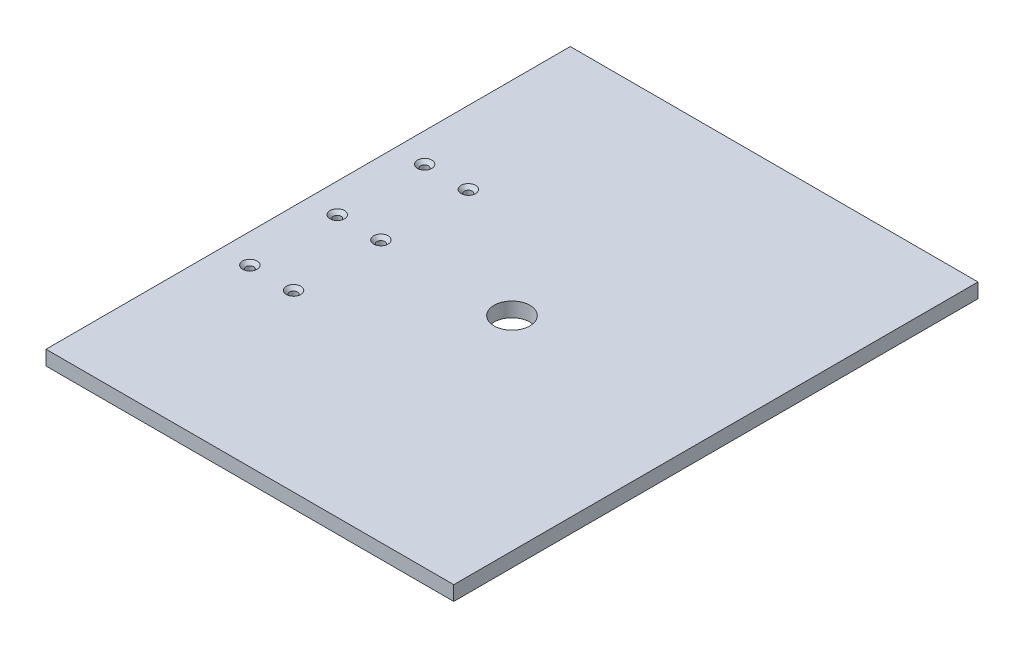
ISO-10303-21;
HEADER;
FILE_DESCRIPTION(('STEP AP214'),'2;1');
FILE_NAME('part.step','',(''),(''),'','','');
FILE_SCHEMA(('AUTOMOTIVE_DESIGN { 1 0 10303 214 1 1 1 1 }'));
ENDSEC;
DATA;
#1=APPLICATION_CONTEXT('core data for automotive mechanical design processes');
#2=APPLICATION_PROTOCOL_DEFINITION('international standard','automotive_design',2000,#1);
#3=PRODUCT_CONTEXT('',#1,'mechanical');
#4=PRODUCT('Part','Part','',(#3));
#5=PRODUCT_RELATED_PRODUCT_CATEGORY('part','',(#4));
#6=PRODUCT_DEFINITION_FORMATION('','',#4);
#7=PRODUCT_DEFINITION_CONTEXT('part definition',#1,'design');
#8=PRODUCT_DEFINITION('design','',#6,#7);
#9=PRODUCT_DEFINITION_SHAPE('','',#8);
#10=(LENGTH_UNIT() NAMED_UNIT(*) SI_UNIT(.MILLI.,.METRE.));
#11=(NAMED_UNIT(*) PLANE_ANGLE_UNIT() SI_UNIT($,.RADIAN.));
#12=(NAMED_UNIT(*) SI_UNIT($,.STERADIAN.) SOLID_ANGLE_UNIT());
#13=UNCERTAINTY_MEASURE_WITH_UNIT(LENGTH_MEASURE(1.E-05),#10,'distance_accuracy_value','');
#14=(GEOMETRIC_REPRESENTATION_CONTEXT(3) GLOBAL_UNCERTAINTY_ASSIGNED_CONTEXT((#13)) GLOBAL_UNIT_ASSIGNED_CONTEXT((#10,
#11,#12)) REPRESENTATION_CONTEXT('',''));
#15=CARTESIAN_POINT('',(0.,0.,0.));
#16=DIRECTION('',(0.,0.,1.));
#17=DIRECTION('',(1.,0.,0.));
#18=AXIS2_PLACEMENT_3D('',#15,#16,#17);
#19=CARTESIAN_POINT('',(177.8,6.35,114.3));
#20=DIRECTION('',(-1.,0.,0.));
#21=DIRECTION('',(0.,0.,1.));
#22=AXIS2_PLACEMENT_3D('',#19,#20,#21);
#23=PLANE('',#22);
#24=DIRECTION('',(0.,0.,-1.));
#25=VECTOR('',#24,1.);
#26=CARTESIAN_POINT('',(177.8,0.,114.3));
#27=LINE('',#26,#25);
#28=CARTESIAN_POINT('',(177.8,0.,114.3));
#29=VERTEX_POINT('',#28);
#30=CARTESIAN_POINT('',(177.8,0.,-114.3));
#31=VERTEX_POINT('',#30);
#32=EDGE_CURVE('E95',#29,#31,#27,.T.);
#33=ORIENTED_EDGE('',*,*,#32,.T.);
#34=DIRECTION('',(0.,-1.,0.));
#35=VECTOR('',#34,1.);
#36=CARTESIAN_POINT('',(177.8,6.35,-114.3));
#37=LINE('',#36,#35);
#38=CARTESIAN_POINT('',(177.8,6.35,-114.3));
#39=VERTEX_POINT('',#38);
#40=EDGE_CURVE('E11',#39,#31,#37,.T.);
#41=ORIENTED_EDGE('',*,*,#40,.F.);
#42=DIRECTION('',(0.,0.,-1.));
#43=VECTOR('',#42,1.);
#44=CARTESIAN_POINT('',(177.8,6.35,114.3));
#45=LINE('',#44,#43);
#46=CARTESIAN_POINT('',(177.8,6.35,114.3));
#47=VERTEX_POINT('',#46);
#48=EDGE_CURVE('E83',#47,#39,#45,.T.);
#49=ORIENTED_EDGE('',*,*,#48,.F.);
#50=DIRECTION('',(0.,-1.,0.));
#51=VECTOR('',#50,1.);
#52=CARTESIAN_POINT('',(177.8,6.35,114.3));
#53=LINE('',#52,#51);
#54=EDGE_CURVE('E91',#47,#29,#53,.T.);
#55=ORIENTED_EDGE('',*,*,#54,.T.);
#56=EDGE_LOOP('',(#33,#41,#49,#55));
#57=FACE_BOUND('',#56,.T.);
#58=ADVANCED_FACE('F32',(#57),#23,.F.);
#59=CARTESIAN_POINT('',(0.,6.35,-114.3));
#60=DIRECTION('',(0.,0.,1.));
#61=DIRECTION('',(1.,0.,0.));
#62=AXIS2_PLACEMENT_3D('',#59,#60,#61);
#63=PLANE('',#62);
#64=DIRECTION('',(-1.,0.,0.));
#65=VECTOR('',#64,1.);
#66=CARTESIAN_POINT('',(0.,0.,-114.3));
#67=LINE('',#66,#65);
#68=CARTESIAN_POINT('',(0.,0.,-114.3));
#69=VERTEX_POINT('',#68);
#70=EDGE_CURVE('E87',#31,#69,#67,.T.);
#71=ORIENTED_EDGE('',*,*,#70,.T.);
#72=DIRECTION('',(0.,-1.,0.));
#73=VECTOR('',#72,1.);
#74=CARTESIAN_POINT('',(0.,6.35,-114.3));
#75=LINE('',#74,#73);
#76=CARTESIAN_POINT('',(0.,6.35,-114.3));
#77=VERTEX_POINT('',#76);
#78=EDGE_CURVE('E40',#77,#69,#75,.T.);
#79=ORIENTED_EDGE('',*,*,#78,.F.);
#80=DIRECTION('',(-1.,0.,0.));
#81=VECTOR('',#80,1.);
#82=CARTESIAN_POINT('',(0.,6.35,-114.3));
#83=LINE('',#82,#81);
#84=EDGE_CURVE('E78',#39,#77,#83,.T.);
#85=ORIENTED_EDGE('',*,*,#84,.F.);
#86=ORIENTED_EDGE('',*,*,#40,.T.);
#87=EDGE_LOOP('',(#71,#79,#85,#86));
#88=FACE_BOUND('',#87,.T.);
#89=ADVANCED_FACE('F86',(#88),#63,.F.);
#90=CARTESIAN_POINT('',(0.,6.35,114.3));
#91=DIRECTION('',(1.,0.,0.));
#92=DIRECTION('',(0.,0.,-1.));
#93=AXIS2_PLACEMENT_3D('',#90,#91,#92);
#94=PLANE('',#93);
#95=DIRECTION('',(0.,0.,1.));
#96=VECTOR('',#95,1.);
#97=CARTESIAN_POINT('',(0.,0.,114.3));
#98=LINE('',#97,#96);
#99=CARTESIAN_POINT('',(0.,0.,114.3));
#100=VERTEX_POINT('',#99);
#101=EDGE_CURVE('E65',#69,#100,#98,.T.);
#102=ORIENTED_EDGE('',*,*,#101,.T.);
#103=DIRECTION('',(0.,-1.,0.));
#104=VECTOR('',#103,1.);
#105=CARTESIAN_POINT('',(0.,6.35,114.3));
#106=LINE('',#105,#104);
#107=CARTESIAN_POINT('',(0.,6.35,114.3));
#108=VERTEX_POINT('',#107);
#109=EDGE_CURVE('E88',#108,#100,#106,.T.);
#110=ORIENTED_EDGE('',*,*,#109,.F.);
#111=DIRECTION('',(0.,0.,1.));
#112=VECTOR('',#111,1.);
#113=CARTESIAN_POINT('',(0.,6.35,114.3));
#114=LINE('',#113,#112);
#115=EDGE_CURVE('E81',#77,#108,#114,.T.);
#116=ORIENTED_EDGE('',*,*,#115,.F.);
#117=ORIENTED_EDGE('',*,*,#78,.T.);
#118=EDGE_LOOP('',(#102,#110,#116,#117));
#119=FACE_BOUND('',#118,.T.);
#120=ADVANCED_FACE('F89',(#119),#94,.F.);
#121=CARTESIAN_POINT('',(0.,6.35,114.3));
#122=DIRECTION('',(0.,0.,-1.));
#123=DIRECTION('',(-1.,0.,0.));
#124=AXIS2_PLACEMENT_3D('',#121,#122,#123);
#125=PLANE('',#124);
#126=DIRECTION('',(1.,0.,0.));
#127=VECTOR('',#126,1.);
#128=CARTESIAN_POINT('',(0.,0.,114.3));
#129=LINE('',#128,#127);
#130=EDGE_CURVE('E71',#100,#29,#129,.T.);
#131=ORIENTED_EDGE('',*,*,#130,.T.);
#132=ORIENTED_EDGE('',*,*,#54,.F.);
#133=DIRECTION('',(1.,0.,0.));
#134=VECTOR('',#133,1.);
#135=CARTESIAN_POINT('',(0.,6.35,114.3));
#136=LINE('',#135,#134);
#137=EDGE_CURVE('E48',#108,#47,#136,.T.);
#138=ORIENTED_EDGE('',*,*,#137,.F.);
#139=ORIENTED_EDGE('',*,*,#109,.T.);
#140=EDGE_LOOP('',(#131,#132,#138,#139));
#141=FACE_BOUND('',#140,.T.);
#142=ADVANCED_FACE('F103',(#141),#125,.F.);
#143=CARTESIAN_POINT('',(0.,6.35,0.));
#144=DIRECTION('',(0.,-1.,0.));
#145=DIRECTION('',(0.,0.,-1.));
#146=AXIS2_PLACEMENT_3D('',#143,#144,#145);
#147=PLANE('',#146);
#148=CARTESIAN_POINT('',(12.7,6.35,0.));
#149=DIRECTION('',(0.,1.,0.));
#150=DIRECTION('',(0.,0.,1.));
#151=AXIS2_PLACEMENT_3D('',#148,#149,#150);
#152=CIRCLE('',#151,3.15);
#153=CARTESIAN_POINT('',(12.7,6.35,3.15));
#154=VERTEX_POINT('',#153);
#155=EDGE_CURVE('E165',#154,#154,#152,.T.);
#156=ORIENTED_EDGE('',*,*,#155,.F.);
#157=EDGE_LOOP('',(#156));
#158=FACE_BOUND('',#157,.T.);
#159=CARTESIAN_POINT('',(12.7,6.35,38.1));
#160=DIRECTION('',(0.,1.,0.));
#161=DIRECTION('',(0.,0.,1.));
#162=AXIS2_PLACEMENT_3D('',#159,#160,#161);
#163=CIRCLE('',#162,3.15);
#164=CARTESIAN_POINT('',(12.7,6.35,41.25));
#165=VERTEX_POINT('',#164);
#166=EDGE_CURVE('E156',#165,#165,#163,.T.);
#167=ORIENTED_EDGE('',*,*,#166,.F.);
#168=EDGE_LOOP('',(#167));
#169=FACE_BOUND('',#168,.T.);
#170=CARTESIAN_POINT('',(31.75,6.35,38.1));
#171=DIRECTION('',(0.,1.,0.));
#172=DIRECTION('',(0.,0.,1.));
#173=AXIS2_PLACEMENT_3D('',#170,#171,#172);
#174=CIRCLE('',#173,3.15);
#175=CARTESIAN_POINT('',(31.75,6.35,41.25));
#176=VERTEX_POINT('',#175);
#177=EDGE_CURVE('E147',#176,#176,#174,.T.);
#178=ORIENTED_EDGE('',*,*,#177,.F.);
#179=EDGE_LOOP('',(#178));
#180=FACE_BOUND('',#179,.T.);
#181=CARTESIAN_POINT('',(12.7,6.35,-38.1));
#182=DIRECTION('',(0.,1.,0.));
#183=DIRECTION('',(0.,0.,1.));
#184=AXIS2_PLACEMENT_3D('',#181,#182,#183);
#185=CIRCLE('',#184,3.15);
#186=CARTESIAN_POINT('',(12.7,6.35,-34.95));
#187=VERTEX_POINT('',#186);
#188=EDGE_CURVE('E138',#187,#187,#185,.T.);
#189=ORIENTED_EDGE('',*,*,#188,.F.);
#190=EDGE_LOOP('',(#189));
#191=FACE_BOUND('',#190,.T.);
#192=CARTESIAN_POINT('',(31.75,6.35,-38.1));
#193=DIRECTION('',(0.,1.,0.));
#194=DIRECTION('',(0.,0.,1.));
#195=AXIS2_PLACEMENT_3D('',#192,#193,#194);
#196=CIRCLE('',#195,3.15);
#197=CARTESIAN_POINT('',(31.75,6.35,-34.95));
#198=VERTEX_POINT('',#197);
#199=EDGE_CURVE('E129',#198,#198,#196,.T.);
#200=ORIENTED_EDGE('',*,*,#199,.F.);
#201=EDGE_LOOP('',(#200));
#202=FACE_BOUND('',#201,.T.);
#203=CARTESIAN_POINT('',(31.75,6.35,0.));
#204=DIRECTION('',(0.,1.,0.));
#205=DIRECTION('',(0.,0.,1.));
#206=AXIS2_PLACEMENT_3D('',#203,#204,#205);
#207=CIRCLE('',#206,3.15);
#208=CARTESIAN_POINT('',(31.75,6.35,3.15));
#209=VERTEX_POINT('',#208);
#210=EDGE_CURVE('E120',#209,#209,#207,.T.);
#211=ORIENTED_EDGE('',*,*,#210,.F.);
#212=EDGE_LOOP('',(#211));
#213=FACE_BOUND('',#212,.T.);
#214=CARTESIAN_POINT('',(88.9,6.35,0.));
#215=DIRECTION('',(0.,1.,0.));
#216=DIRECTION('',(0.,0.,1.));
#217=AXIS2_PLACEMENT_3D('',#214,#215,#216);
#218=CIRCLE('',#217,7.81000000100001);
#219=CARTESIAN_POINT('',(88.9,6.35,7.81000000100001));
#220=VERTEX_POINT('',#219);
#221=EDGE_CURVE('E98',#220,#220,#218,.T.);
#222=ORIENTED_EDGE('',*,*,#221,.F.);
#223=EDGE_LOOP('',(#222));
#224=FACE_BOUND('',#223,.T.);
#225=ORIENTED_EDGE('',*,*,#48,.T.);
#226=ORIENTED_EDGE('',*,*,#84,.T.);
#227=ORIENTED_EDGE('',*,*,#115,.T.);
#228=ORIENTED_EDGE('',*,*,#137,.T.);
#229=EDGE_LOOP('',(#225,#226,#227,#228));
#230=FACE_BOUND('',#229,.T.);
#231=ADVANCED_FACE('F79',(#158,#169,#180,#191,#202,#213,#224,#230),#147,.F.);
#232=CARTESIAN_POINT('',(0.,0.,0.));
#233=DIRECTION('',(0.,-1.,0.));
#234=DIRECTION('',(0.,0.,-1.));
#235=AXIS2_PLACEMENT_3D('',#232,#233,#234);
#236=PLANE('',#235);
#237=CARTESIAN_POINT('',(12.7,0.,0.));
#238=DIRECTION('',(0.,1.,0.));
#239=DIRECTION('',(0.,0.,1.));
#240=AXIS2_PLACEMENT_3D('',#237,#238,#239);
#241=CIRCLE('',#240,1.7);
#242=CARTESIAN_POINT('',(12.7,0.,1.7));
#243=VERTEX_POINT('',#242);
#244=EDGE_CURVE('E159',#243,#243,#241,.T.);
#245=ORIENTED_EDGE('',*,*,#244,.T.);
#246=EDGE_LOOP('',(#245));
#247=FACE_BOUND('',#246,.T.);
#248=CARTESIAN_POINT('',(12.7,0.,38.1));
#249=DIRECTION('',(0.,1.,0.));
#250=DIRECTION('',(0.,0.,1.));
#251=AXIS2_PLACEMENT_3D('',#248,#249,#250);
#252=CIRCLE('',#251,1.7);
#253=CARTESIAN_POINT('',(12.7,0.,39.8));
#254=VERTEX_POINT('',#253);
#255=EDGE_CURVE('E150',#254,#254,#252,.T.);
#256=ORIENTED_EDGE('',*,*,#255,.T.);
#257=EDGE_LOOP('',(#256));
#258=FACE_BOUND('',#257,.T.);
#259=CARTESIAN_POINT('',(31.75,0.,38.1));
#260=DIRECTION('',(0.,1.,0.));
#261=DIRECTION('',(0.,0.,1.));
#262=AXIS2_PLACEMENT_3D('',#259,#260,#261);
#263=CIRCLE('',#262,1.7);
#264=CARTESIAN_POINT('',(31.75,0.,39.8));
#265=VERTEX_POINT('',#264);
#266=EDGE_CURVE('E141',#265,#265,#263,.T.);
#267=ORIENTED_EDGE('',*,*,#266,.T.);
#268=EDGE_LOOP('',(#267));
#269=FACE_BOUND('',#268,.T.);
#270=CARTESIAN_POINT('',(12.7,0.,-38.1));
#271=DIRECTION('',(0.,1.,0.));
#272=DIRECTION('',(0.,0.,1.));
#273=AXIS2_PLACEMENT_3D('',#270,#271,#272);
#274=CIRCLE('',#273,1.7);
#275=CARTESIAN_POINT('',(12.7,0.,-36.4));
#276=VERTEX_POINT('',#275);
#277=EDGE_CURVE('E132',#276,#276,#274,.T.);
#278=ORIENTED_EDGE('',*,*,#277,.T.);
#279=EDGE_LOOP('',(#278));
#280=FACE_BOUND('',#279,.T.);
#281=CARTESIAN_POINT('',(31.75,0.,-38.1));
#282=DIRECTION('',(0.,1.,0.));
#283=DIRECTION('',(0.,0.,1.));
#284=AXIS2_PLACEMENT_3D('',#281,#282,#283);
#285=CIRCLE('',#284,1.7);
#286=CARTESIAN_POINT('',(31.75,0.,-36.4));
#287=VERTEX_POINT('',#286);
#288=EDGE_CURVE('E123',#287,#287,#285,.T.);
#289=ORIENTED_EDGE('',*,*,#288,.T.);
#290=EDGE_LOOP('',(#289));
#291=FACE_BOUND('',#290,.T.);
#292=CARTESIAN_POINT('',(31.75,0.,0.));
#293=DIRECTION('',(0.,1.,0.));
#294=DIRECTION('',(0.,0.,1.));
#295=AXIS2_PLACEMENT_3D('',#292,#293,#294);
#296=CIRCLE('',#295,1.7);
#297=CARTESIAN_POINT('',(31.75,0.,1.7));
#298=VERTEX_POINT('',#297);
#299=EDGE_CURVE('E112',#298,#298,#296,.T.);
#300=ORIENTED_EDGE('',*,*,#299,.T.);
#301=EDGE_LOOP('',(#300));
#302=FACE_BOUND('',#301,.T.);
#303=CARTESIAN_POINT('',(88.9,0.,0.));
#304=DIRECTION('',(0.,-1.,0.));
#305=DIRECTION('',(0.,0.,-1.));
#306=AXIS2_PLACEMENT_3D('',#303,#304,#305);
#307=CIRCLE('',#306,7.81000000100001);
#308=CARTESIAN_POINT('',(88.9,0.,-7.81000000100001));
#309=VERTEX_POINT('',#308);
#310=EDGE_CURVE('E109',#309,#309,#307,.F.);
#311=ORIENTED_EDGE('',*,*,#310,.T.);
#312=EDGE_LOOP('',(#311));
#313=FACE_BOUND('',#312,.T.);
#314=ORIENTED_EDGE('',*,*,#32,.F.);
#315=ORIENTED_EDGE('',*,*,#130,.F.);
#316=ORIENTED_EDGE('',*,*,#101,.F.);
#317=ORIENTED_EDGE('',*,*,#70,.F.);
#318=EDGE_LOOP('',(#314,#315,#316,#317));
#319=FACE_BOUND('',#318,.T.);
#320=ADVANCED_FACE('F106',(#247,#258,#269,#280,#291,#302,#313,#319),#236,.T.);
#321=CARTESIAN_POINT('',(88.9,-0.00100000000000013,0.));
#322=DIRECTION('',(0.,1.,0.));
#323=DIRECTION('',(0.,0.,1.));
#324=AXIS2_PLACEMENT_3D('',#321,#322,#323);
#325=CYLINDRICAL_SURFACE('',#324,7.81000000100001);
#326=ORIENTED_EDGE('',*,*,#310,.F.);
#327=EDGE_LOOP('',(#326));
#328=FACE_BOUND('',#327,.T.);
#329=ORIENTED_EDGE('',*,*,#221,.T.);
#330=EDGE_LOOP('',(#329));
#331=FACE_BOUND('',#330,.T.);
#332=ADVANCED_FACE('F186',(#328,#331),#325,.F.);
#333=CARTESIAN_POINT('',(31.75,6.35,0.));
#334=DIRECTION('',(0.,1.,0.));
#335=DIRECTION('',(0.,0.,1.));
#336=AXIS2_PLACEMENT_3D('',#333,#334,#335);
#337=CYLINDRICAL_SURFACE('',#336,1.7);
#338=ORIENTED_EDGE('',*,*,#299,.F.);
#339=EDGE_LOOP('',(#338));
#340=FACE_BOUND('',#339,.T.);
#341=CARTESIAN_POINT('',(31.75,4.9,0.));
#342=DIRECTION('',(0.,1.,0.));
#343=DIRECTION('',(0.,0.,1.));
#344=AXIS2_PLACEMENT_3D('',#341,#342,#343);
#345=CIRCLE('',#344,1.7);
#346=CARTESIAN_POINT('',(31.75,4.9,1.7));
#347=VERTEX_POINT('',#346);
#348=EDGE_CURVE('E117',#347,#347,#345,.T.);
#349=ORIENTED_EDGE('',*,*,#348,.T.);
#350=EDGE_LOOP('',(#349));
#351=FACE_BOUND('',#350,.T.);
#352=ADVANCED_FACE('F188',(#340,#351),#337,.F.);
#353=CARTESIAN_POINT('',(31.75,6.35,0.));
#354=DIRECTION('',(0.,1.,0.));
#355=DIRECTION('',(0.,0.,1.));
#356=AXIS2_PLACEMENT_3D('',#353,#354,#355);
#357=CONICAL_SURFACE('',#356,3.15,0.785398163397448);
#358=ORIENTED_EDGE('',*,*,#348,.F.);
#359=EDGE_LOOP('',(#358));
#360=FACE_BOUND('',#359,.T.);
#361=ORIENTED_EDGE('',*,*,#210,.T.);
#362=EDGE_LOOP('',(#361));
#363=FACE_BOUND('',#362,.T.);
#364=ADVANCED_FACE('F195',(#360,#363),#357,.F.);
#365=CARTESIAN_POINT('',(31.75,6.35,-38.1));
#366=DIRECTION('',(0.,1.,0.));
#367=DIRECTION('',(0.,0.,1.));
#368=AXIS2_PLACEMENT_3D('',#365,#366,#367);
#369=CYLINDRICAL_SURFACE('',#368,1.7);
#370=ORIENTED_EDGE('',*,*,#288,.F.);
#371=EDGE_LOOP('',(#370));
#372=FACE_BOUND('',#371,.T.);
#373=CARTESIAN_POINT('',(31.75,4.9,-38.1));
#374=DIRECTION('',(0.,1.,0.));
#375=DIRECTION('',(0.,0.,1.));
#376=AXIS2_PLACEMENT_3D('',#373,#374,#375);
#377=CIRCLE('',#376,1.7);
#378=CARTESIAN_POINT('',(31.75,4.9,-36.4));
#379=VERTEX_POINT('',#378);
#380=EDGE_CURVE('E126',#379,#379,#377,.T.);
#381=ORIENTED_EDGE('',*,*,#380,.T.);
#382=EDGE_LOOP('',(#381));
#383=FACE_BOUND('',#382,.T.);
#384=ADVANCED_FACE('F239',(#372,#383),#369,.F.);
#385=CARTESIAN_POINT('',(31.75,6.35,-38.1));
#386=DIRECTION('',(0.,1.,0.));
#387=DIRECTION('',(0.,0.,1.));
#388=AXIS2_PLACEMENT_3D('',#385,#386,#387);
#389=CONICAL_SURFACE('',#388,3.15,0.785398163397448);
#390=ORIENTED_EDGE('',*,*,#380,.F.);
#391=EDGE_LOOP('',(#390));
#392=FACE_BOUND('',#391,.T.);
#393=ORIENTED_EDGE('',*,*,#199,.T.);
#394=EDGE_LOOP('',(#393));
#395=FACE_BOUND('',#394,.T.);
#396=ADVANCED_FACE('F249',(#392,#395),#389,.F.);
#397=CARTESIAN_POINT('',(12.7,6.35,-38.1));
#398=DIRECTION('',(0.,1.,0.));
#399=DIRECTION('',(0.,0.,1.));
#400=AXIS2_PLACEMENT_3D('',#397,#398,#399);
#401=CYLINDRICAL_SURFACE('',#400,1.7);
#402=ORIENTED_EDGE('',*,*,#277,.F.);
#403=EDGE_LOOP('',(#402));
#404=FACE_BOUND('',#403,.T.);
#405=CARTESIAN_POINT('',(12.7,4.9,-38.1));
#406=DIRECTION('',(0.,1.,0.));
#407=DIRECTION('',(0.,0.,1.));
#408=AXIS2_PLACEMENT_3D('',#405,#406,#407);
#409=CIRCLE('',#408,1.7);
#410=CARTESIAN_POINT('',(12.7,4.9,-36.4));
#411=VERTEX_POINT('',#410);
#412=EDGE_CURVE('E135',#411,#411,#409,.T.);
#413=ORIENTED_EDGE('',*,*,#412,.T.);
#414=EDGE_LOOP('',(#413));
#415=FACE_BOUND('',#414,.T.);
#416=ADVANCED_FACE('F259',(#404,#415),#401,.F.);
#417=CARTESIAN_POINT('',(12.7,6.35,-38.1));
#418=DIRECTION('',(0.,1.,0.));
#419=DIRECTION('',(0.,0.,1.));
#420=AXIS2_PLACEMENT_3D('',#417,#418,#419);
#421=CONICAL_SURFACE('',#420,3.15,0.78539816339745);
#422=ORIENTED_EDGE('',*,*,#412,.F.);
#423=EDGE_LOOP('',(#422));
#424=FACE_BOUND('',#423,.T.);
#425=ORIENTED_EDGE('',*,*,#188,.T.);
#426=EDGE_LOOP('',(#425));
#427=FACE_BOUND('',#426,.T.);
#428=ADVANCED_FACE('F269',(#424,#427),#421,.F.);
#429=CARTESIAN_POINT('',(31.75,6.35,38.1));
#430=DIRECTION('',(0.,1.,0.));
#431=DIRECTION('',(0.,0.,1.));
#432=AXIS2_PLACEMENT_3D('',#429,#430,#431);
#433=CYLINDRICAL_SURFACE('',#432,1.7);
#434=ORIENTED_EDGE('',*,*,#266,.F.);
#435=EDGE_LOOP('',(#434));
#436=FACE_BOUND('',#435,.T.);
#437=CARTESIAN_POINT('',(31.75,4.9,38.1));
#438=DIRECTION('',(0.,1.,0.));
#439=DIRECTION('',(0.,0.,1.));
#440=AXIS2_PLACEMENT_3D('',#437,#438,#439);
#441=CIRCLE('',#440,1.7);
#442=CARTESIAN_POINT('',(31.75,4.9,39.8));
#443=VERTEX_POINT('',#442);
#444=EDGE_CURVE('E144',#443,#443,#441,.T.);
#445=ORIENTED_EDGE('',*,*,#444,.T.);
#446=EDGE_LOOP('',(#445));
#447=FACE_BOUND('',#446,.T.);
#448=ADVANCED_FACE('F279',(#436,#447),#433,.F.);
#449=CARTESIAN_POINT('',(31.75,6.35,38.1));
#450=DIRECTION('',(0.,1.,0.));
#451=DIRECTION('',(0.,0.,1.));
#452=AXIS2_PLACEMENT_3D('',#449,#450,#451);
#453=CONICAL_SURFACE('',#452,3.15,0.785398163397448);
#454=ORIENTED_EDGE('',*,*,#444,.F.);
#455=EDGE_LOOP('',(#454));
#456=FACE_BOUND('',#455,.T.);
#457=ORIENTED_EDGE('',*,*,#177,.T.);
#458=EDGE_LOOP('',(#457));
#459=FACE_BOUND('',#458,.T.);
#460=ADVANCED_FACE('F289',(#456,#459),#453,.F.);
#461=CARTESIAN_POINT('',(12.7,6.35,38.1));
#462=DIRECTION('',(0.,1.,0.));
#463=DIRECTION('',(0.,0.,1.));
#464=AXIS2_PLACEMENT_3D('',#461,#462,#463);
#465=CYLINDRICAL_SURFACE('',#464,1.7);
#466=ORIENTED_EDGE('',*,*,#255,.F.);
#467=EDGE_LOOP('',(#466));
#468=FACE_BOUND('',#467,.T.);
#469=CARTESIAN_POINT('',(12.7,4.9,38.1));
#470=DIRECTION('',(0.,1.,0.));
#471=DIRECTION('',(0.,0.,1.));
#472=AXIS2_PLACEMENT_3D('',#469,#470,#471);
#473=CIRCLE('',#472,1.7);
#474=CARTESIAN_POINT('',(12.7,4.9,39.8));
#475=VERTEX_POINT('',#474);
#476=EDGE_CURVE('E153',#475,#475,#473,.T.);
#477=ORIENTED_EDGE('',*,*,#476,.T.);
#478=EDGE_LOOP('',(#477));
#479=FACE_BOUND('',#478,.T.);
#480=ADVANCED_FACE('F299',(#468,#479),#465,.F.);
#481=CARTESIAN_POINT('',(12.7,6.35,38.1));
#482=DIRECTION('',(0.,1.,0.));
#483=DIRECTION('',(0.,0.,1.));
#484=AXIS2_PLACEMENT_3D('',#481,#482,#483);
#485=CONICAL_SURFACE('',#484,3.15,0.785398163397449);
#486=ORIENTED_EDGE('',*,*,#476,.F.);
#487=EDGE_LOOP('',(#486));
#488=FACE_BOUND('',#487,.T.);
#489=ORIENTED_EDGE('',*,*,#166,.T.);
#490=EDGE_LOOP('',(#489));
#491=FACE_BOUND('',#490,.T.);
#492=ADVANCED_FACE('F309',(#488,#491),#485,.F.);
#493=CARTESIAN_POINT('',(12.7,6.35,0.));
#494=DIRECTION('',(0.,1.,0.));
#495=DIRECTION('',(0.,0.,1.));
#496=AXIS2_PLACEMENT_3D('',#493,#494,#495);
#497=CYLINDRICAL_SURFACE('',#496,1.7);
#498=ORIENTED_EDGE('',*,*,#244,.F.);
#499=EDGE_LOOP('',(#498));
#500=FACE_BOUND('',#499,.T.);
#501=CARTESIAN_POINT('',(12.7,4.9,0.));
#502=DIRECTION('',(0.,1.,0.));
#503=DIRECTION('',(0.,0.,1.));
#504=AXIS2_PLACEMENT_3D('',#501,#502,#503);
#505=CIRCLE('',#504,1.7);
#506=CARTESIAN_POINT('',(12.7,4.9,1.7));
#507=VERTEX_POINT('',#506);
#508=EDGE_CURVE('E162',#507,#507,#505,.T.);
#509=ORIENTED_EDGE('',*,*,#508,.T.);
#510=EDGE_LOOP('',(#509));
#511=FACE_BOUND('',#510,.T.);
#512=ADVANCED_FACE('F319',(#500,#511),#497,.F.);
#513=CARTESIAN_POINT('',(12.7,6.35,0.));
#514=DIRECTION('',(0.,1.,0.));
#515=DIRECTION('',(0.,0.,1.));
#516=AXIS2_PLACEMENT_3D('',#513,#514,#515);
#517=CONICAL_SURFACE('',#516,3.15,0.78539816339745);
#518=ORIENTED_EDGE('',*,*,#508,.F.);
#519=EDGE_LOOP('',(#518));
#520=FACE_BOUND('',#519,.T.);
#521=ORIENTED_EDGE('',*,*,#155,.T.);
#522=EDGE_LOOP('',(#521));
#523=FACE_BOUND('',#522,.T.);
#524=ADVANCED_FACE('F169',(#520,#523),#517,.F.);
#525=CLOSED_SHELL('',(#58,#89,#120,#142,#231,#320,#332,#352,#364,#384,#396,#416,#428,#448,#460,
#480,#492,#512,#524));
#526=MANIFOLD_SOLID_BREP('B2',#525);
#527=ADVANCED_BREP_SHAPE_REPRESENTATION('',(#18,#526),#14);
#528=SHAPE_DEFINITION_REPRESENTATION(#9,#527);
ENDSEC;
END-ISO-10303-21;
